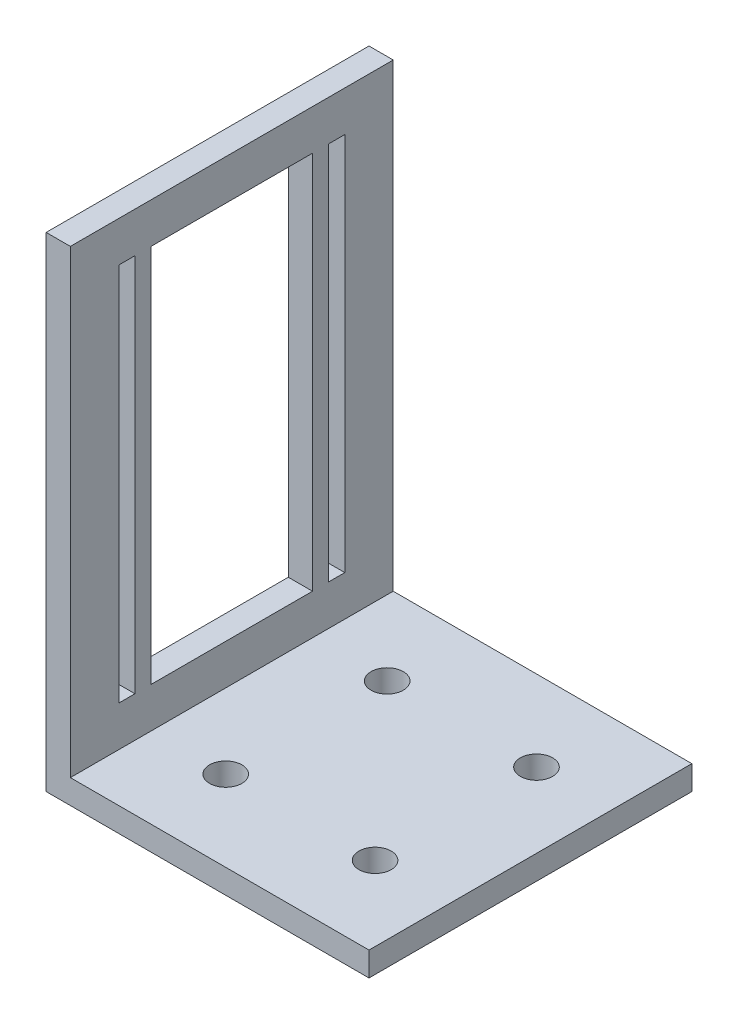
ISO-10303-21;
HEADER;
FILE_DESCRIPTION(('STEP AP214'),'2;1');
FILE_NAME('part.step','',(''),(''),'','','');
FILE_SCHEMA(('AUTOMOTIVE_DESIGN { 1 0 10303 214 1 1 1 1 }'));
ENDSEC;
DATA;
#1=APPLICATION_CONTEXT('core data for automotive mechanical design processes');
#2=APPLICATION_PROTOCOL_DEFINITION('international standard','automotive_design',2000,#1);
#3=PRODUCT_CONTEXT('',#1,'mechanical');
#4=PRODUCT('Part','Part','',(#3));
#5=PRODUCT_RELATED_PRODUCT_CATEGORY('part','',(#4));
#6=PRODUCT_DEFINITION_FORMATION('','',#4);
#7=PRODUCT_DEFINITION_CONTEXT('part definition',#1,'design');
#8=PRODUCT_DEFINITION('design','',#6,#7);
#9=PRODUCT_DEFINITION_SHAPE('','',#8);
#10=(LENGTH_UNIT() NAMED_UNIT(*) SI_UNIT(.MILLI.,.METRE.));
#11=(NAMED_UNIT(*) PLANE_ANGLE_UNIT() SI_UNIT($,.RADIAN.));
#12=(NAMED_UNIT(*) SI_UNIT($,.STERADIAN.) SOLID_ANGLE_UNIT());
#13=UNCERTAINTY_MEASURE_WITH_UNIT(LENGTH_MEASURE(1.E-05),#10,'distance_accuracy_value','');
#14=(GEOMETRIC_REPRESENTATION_CONTEXT(3) GLOBAL_UNCERTAINTY_ASSIGNED_CONTEXT((#13)) GLOBAL_UNIT_ASSIGNED_CONTEXT((#10,
#11,#12)) REPRESENTATION_CONTEXT('',''));
#15=CARTESIAN_POINT('',(0.,0.,0.));
#16=DIRECTION('',(0.,0.,1.));
#17=DIRECTION('',(1.,0.,0.));
#18=AXIS2_PLACEMENT_3D('',#15,#16,#17);
#19=CARTESIAN_POINT('',(0.,0.,40.));
#20=DIRECTION('',(-1.,0.,0.));
#21=DIRECTION('',(0.,-1.,0.));
#22=AXIS2_PLACEMENT_3D('',#19,#20,#21);
#23=PLANE('',#22);
#24=DIRECTION('',(0.,1.,0.));
#25=VECTOR('',#24,1.);
#26=CARTESIAN_POINT('',(0.,0.,0.));
#27=LINE('',#26,#25);
#28=CARTESIAN_POINT('',(0.,0.,0.));
#29=VERTEX_POINT('',#28);
#30=CARTESIAN_POINT('',(0.,3.,0.));
#31=VERTEX_POINT('',#30);
#32=EDGE_CURVE('E289',#29,#31,#27,.T.);
#33=ORIENTED_EDGE('',*,*,#32,.T.);
#34=DIRECTION('',(0.,0.,-1.));
#35=VECTOR('',#34,1.);
#36=CARTESIAN_POINT('',(0.,3.,40.));
#37=LINE('',#36,#35);
#38=CARTESIAN_POINT('',(0.,3.,40.));
#39=VERTEX_POINT('',#38);
#40=EDGE_CURVE('E11',#39,#31,#37,.T.);
#41=ORIENTED_EDGE('',*,*,#40,.F.);
#42=DIRECTION('',(0.,1.,0.));
#43=VECTOR('',#42,1.);
#44=CARTESIAN_POINT('',(0.,0.,40.));
#45=LINE('',#44,#43);
#46=CARTESIAN_POINT('',(0.,0.,40.));
#47=VERTEX_POINT('',#46);
#48=EDGE_CURVE('E274',#47,#39,#45,.T.);
#49=ORIENTED_EDGE('',*,*,#48,.F.);
#50=DIRECTION('',(0.,0.,-1.));
#51=VECTOR('',#50,1.);
#52=CARTESIAN_POINT('',(0.,0.,40.));
#53=LINE('',#52,#51);
#54=EDGE_CURVE('E288',#47,#29,#53,.T.);
#55=ORIENTED_EDGE('',*,*,#54,.T.);
#56=EDGE_LOOP('',(#33,#41,#49,#55));
#57=FACE_BOUND('',#56,.T.);
#58=ADVANCED_FACE('F33',(#57),#23,.F.);
#59=CARTESIAN_POINT('',(0.,3.,40.));
#60=DIRECTION('',(0.,-1.,0.));
#61=DIRECTION('',(1.,0.,0.));
#62=AXIS2_PLACEMENT_3D('',#59,#60,#61);
#63=PLANE('',#62);
#64=CARTESIAN_POINT('',(-9.25,3.,10.));
#65=DIRECTION('',(0.,1.,0.));
#66=DIRECTION('',(0.,0.,-1.));
#67=AXIS2_PLACEMENT_3D('',#64,#65,#66);
#68=CIRCLE('',#67,2.);
#69=CARTESIAN_POINT('',(-9.25,3.,8.));
#70=VERTEX_POINT('',#69);
#71=EDGE_CURVE('E261',#70,#70,#68,.T.);
#72=ORIENTED_EDGE('',*,*,#71,.F.);
#73=EDGE_LOOP('',(#72));
#74=FACE_BOUND('',#73,.T.);
#75=CARTESIAN_POINT('',(-27.75,3.,10.));
#76=DIRECTION('',(0.,1.,0.));
#77=DIRECTION('',(0.,0.,1.));
#78=AXIS2_PLACEMENT_3D('',#75,#76,#77);
#79=CIRCLE('',#78,2.);
#80=CARTESIAN_POINT('',(-27.75,3.,12.));
#81=VERTEX_POINT('',#80);
#82=EDGE_CURVE('E266',#81,#81,#79,.T.);
#83=ORIENTED_EDGE('',*,*,#82,.F.);
#84=EDGE_LOOP('',(#83));
#85=FACE_BOUND('',#84,.T.);
#86=CARTESIAN_POINT('',(-27.75,3.,30.));
#87=DIRECTION('',(0.,1.,0.));
#88=DIRECTION('',(0.,0.,-1.));
#89=AXIS2_PLACEMENT_3D('',#86,#87,#88);
#90=CIRCLE('',#89,2.);
#91=CARTESIAN_POINT('',(-27.75,3.,28.));
#92=VERTEX_POINT('',#91);
#93=EDGE_CURVE('E262',#92,#92,#90,.T.);
#94=ORIENTED_EDGE('',*,*,#93,.F.);
#95=EDGE_LOOP('',(#94));
#96=FACE_BOUND('',#95,.T.);
#97=CARTESIAN_POINT('',(-9.25,3.,30.));
#98=DIRECTION('',(0.,1.,0.));
#99=DIRECTION('',(0.,0.,1.));
#100=AXIS2_PLACEMENT_3D('',#97,#98,#99);
#101=CIRCLE('',#100,2.);
#102=CARTESIAN_POINT('',(-9.25,3.,32.));
#103=VERTEX_POINT('',#102);
#104=EDGE_CURVE('E265',#103,#103,#101,.T.);
#105=ORIENTED_EDGE('',*,*,#104,.F.);
#106=EDGE_LOOP('',(#105));
#107=FACE_BOUND('',#106,.T.);
#108=DIRECTION('',(-1.,0.,0.));
#109=VECTOR('',#108,1.);
#110=CARTESIAN_POINT('',(0.,3.,0.));
#111=LINE('',#110,#109);
#112=CARTESIAN_POINT('',(-37.,3.,0.));
#113=VERTEX_POINT('',#112);
#114=EDGE_CURVE('E292',#31,#113,#111,.T.);
#115=ORIENTED_EDGE('',*,*,#114,.T.);
#116=DIRECTION('',(0.,0.,-1.));
#117=VECTOR('',#116,1.);
#118=CARTESIAN_POINT('',(-37.,3.,40.));
#119=LINE('',#118,#117);
#120=CARTESIAN_POINT('',(-37.,3.,40.));
#121=VERTEX_POINT('',#120);
#122=EDGE_CURVE('E41',#121,#113,#119,.T.);
#123=ORIENTED_EDGE('',*,*,#122,.F.);
#124=DIRECTION('',(-1.,0.,0.));
#125=VECTOR('',#124,1.);
#126=CARTESIAN_POINT('',(0.,3.,40.));
#127=LINE('',#126,#125);
#128=EDGE_CURVE('E277',#39,#121,#127,.T.);
#129=ORIENTED_EDGE('',*,*,#128,.F.);
#130=ORIENTED_EDGE('',*,*,#40,.T.);
#131=EDGE_LOOP('',(#115,#123,#129,#130));
#132=FACE_BOUND('',#131,.T.);
#133=ADVANCED_FACE('F345',(#74,#85,#96,#107,#132),#63,.F.);
#134=CARTESIAN_POINT('',(-37.,3.,40.));
#135=DIRECTION('',(-1.,0.,0.));
#136=DIRECTION('',(0.,0.,1.));
#137=AXIS2_PLACEMENT_3D('',#134,#135,#136);
#138=PLANE('',#137);
#139=DIRECTION('',(0.,1.,0.));
#140=VECTOR('',#139,1.);
#141=CARTESIAN_POINT('',(-37.,2.99999999999999,34.));
#142=LINE('',#141,#140);
#143=CARTESIAN_POINT('',(-37.,8.,34.));
#144=VERTEX_POINT('',#143);
#145=CARTESIAN_POINT('',(-37.,55.,34.));
#146=VERTEX_POINT('',#145);
#147=EDGE_CURVE('E255',#144,#146,#142,.T.);
#148=ORIENTED_EDGE('',*,*,#147,.T.);
#149=DIRECTION('',(0.,0.,-1.));
#150=VECTOR('',#149,1.);
#151=CARTESIAN_POINT('',(-37.,55.,40.));
#152=LINE('',#151,#150);
#153=CARTESIAN_POINT('',(-37.,55.,32.));
#154=VERTEX_POINT('',#153);
#155=EDGE_CURVE('E258',#146,#154,#152,.T.);
#156=ORIENTED_EDGE('',*,*,#155,.T.);
#157=DIRECTION('',(0.,-1.,0.));
#158=VECTOR('',#157,1.);
#159=CARTESIAN_POINT('',(-37.,2.99999999999999,32.));
#160=LINE('',#159,#158);
#161=CARTESIAN_POINT('',(-37.,8.,32.));
#162=VERTEX_POINT('',#161);
#163=EDGE_CURVE('E252',#154,#162,#160,.T.);
#164=ORIENTED_EDGE('',*,*,#163,.T.);
#165=DIRECTION('',(0.,0.,1.));
#166=VECTOR('',#165,1.);
#167=CARTESIAN_POINT('',(-37.,8.00000000000001,40.));
#168=LINE('',#167,#166);
#169=EDGE_CURVE('E164',#162,#144,#168,.T.);
#170=ORIENTED_EDGE('',*,*,#169,.T.);
#171=EDGE_LOOP('',(#148,#156,#164,#170));
#172=FACE_BOUND('',#171,.T.);
#173=DIRECTION('',(0.,0.,1.));
#174=VECTOR('',#173,1.);
#175=CARTESIAN_POINT('',(-37.,7.99999999999999,40.));
#176=LINE('',#175,#174);
#177=CARTESIAN_POINT('',(-37.,7.99999999999999,6.00000000000001));
#178=VERTEX_POINT('',#177);
#179=CARTESIAN_POINT('',(-37.,7.99999999999999,8.00000000000001));
#180=VERTEX_POINT('',#179);
#181=EDGE_CURVE('E246',#178,#180,#176,.T.);
#182=ORIENTED_EDGE('',*,*,#181,.T.);
#183=DIRECTION('',(0.,1.,0.));
#184=VECTOR('',#183,1.);
#185=CARTESIAN_POINT('',(-37.,2.99999999999999,8.00000000000001));
#186=LINE('',#185,#184);
#187=CARTESIAN_POINT('',(-37.,55.,8.));
#188=VERTEX_POINT('',#187);
#189=EDGE_CURVE('E249',#180,#188,#186,.T.);
#190=ORIENTED_EDGE('',*,*,#189,.T.);
#191=DIRECTION('',(0.,0.,-1.));
#192=VECTOR('',#191,1.);
#193=CARTESIAN_POINT('',(-37.,55.,40.));
#194=LINE('',#193,#192);
#195=CARTESIAN_POINT('',(-37.,55.,6.));
#196=VERTEX_POINT('',#195);
#197=EDGE_CURVE('E240',#188,#196,#194,.T.);
#198=ORIENTED_EDGE('',*,*,#197,.T.);
#199=DIRECTION('',(0.,-1.,0.));
#200=VECTOR('',#199,1.);
#201=CARTESIAN_POINT('',(-37.,2.99999999999999,6.00000000000001));
#202=LINE('',#201,#200);
#203=EDGE_CURVE('E243',#196,#178,#202,.T.);
#204=ORIENTED_EDGE('',*,*,#203,.T.);
#205=EDGE_LOOP('',(#182,#190,#198,#204));
#206=FACE_BOUND('',#205,.T.);
#207=DIRECTION('',(0.,1.,0.));
#208=VECTOR('',#207,1.);
#209=CARTESIAN_POINT('',(-37.,2.99999999999999,30.));
#210=LINE('',#209,#208);
#211=CARTESIAN_POINT('',(-37.,7.99999999999999,30.));
#212=VERTEX_POINT('',#211);
#213=CARTESIAN_POINT('',(-37.,55.,30.));
#214=VERTEX_POINT('',#213);
#215=EDGE_CURVE('E234',#212,#214,#210,.T.);
#216=ORIENTED_EDGE('',*,*,#215,.T.);
#217=DIRECTION('',(0.,0.,-1.));
#218=VECTOR('',#217,1.);
#219=CARTESIAN_POINT('',(-37.,55.,40.));
#220=LINE('',#219,#218);
#221=CARTESIAN_POINT('',(-37.,55.,10.));
#222=VERTEX_POINT('',#221);
#223=EDGE_CURVE('E237',#214,#222,#220,.T.);
#224=ORIENTED_EDGE('',*,*,#223,.T.);
#225=DIRECTION('',(0.,-1.,0.));
#226=VECTOR('',#225,1.);
#227=CARTESIAN_POINT('',(-37.,2.99999999999999,10.));
#228=LINE('',#227,#226);
#229=CARTESIAN_POINT('',(-37.,7.99999999999999,10.));
#230=VERTEX_POINT('',#229);
#231=EDGE_CURVE('E188',#222,#230,#228,.T.);
#232=ORIENTED_EDGE('',*,*,#231,.T.);
#233=DIRECTION('',(0.,0.,1.));
#234=VECTOR('',#233,1.);
#235=CARTESIAN_POINT('',(-37.,7.99999999999999,40.));
#236=LINE('',#235,#234);
#237=EDGE_CURVE('E231',#230,#212,#236,.T.);
#238=ORIENTED_EDGE('',*,*,#237,.T.);
#239=EDGE_LOOP('',(#216,#224,#232,#238));
#240=FACE_BOUND('',#239,.T.);
#241=DIRECTION('',(0.,1.,0.));
#242=VECTOR('',#241,1.);
#243=CARTESIAN_POINT('',(-37.,3.,0.));
#244=LINE('',#243,#242);
#245=CARTESIAN_POINT('',(-37.,60.,0.));
#246=VERTEX_POINT('',#245);
#247=EDGE_CURVE('E294',#113,#246,#244,.T.);
#248=ORIENTED_EDGE('',*,*,#247,.T.);
#249=DIRECTION('',(0.,0.,-1.));
#250=VECTOR('',#249,1.);
#251=CARTESIAN_POINT('',(-37.,60.,40.));
#252=LINE('',#251,#250);
#253=CARTESIAN_POINT('',(-37.,60.,40.));
#254=VERTEX_POINT('',#253);
#255=EDGE_CURVE('E309',#254,#246,#252,.T.);
#256=ORIENTED_EDGE('',*,*,#255,.F.);
#257=DIRECTION('',(0.,1.,0.));
#258=VECTOR('',#257,1.);
#259=CARTESIAN_POINT('',(-37.,3.,40.));
#260=LINE('',#259,#258);
#261=EDGE_CURVE('E280',#121,#254,#260,.T.);
#262=ORIENTED_EDGE('',*,*,#261,.F.);
#263=ORIENTED_EDGE('',*,*,#122,.T.);
#264=EDGE_LOOP('',(#248,#256,#262,#263));
#265=FACE_BOUND('',#264,.T.);
#266=ADVANCED_FACE('F350',(#172,#206,#240,#265),#138,.F.);
#267=CARTESIAN_POINT('',(-37.,60.,40.));
#268=DIRECTION('',(0.,-1.,0.));
#269=DIRECTION('',(0.,0.,-1.));
#270=AXIS2_PLACEMENT_3D('',#267,#268,#269);
#271=PLANE('',#270);
#272=DIRECTION('',(-1.,0.,0.));
#273=VECTOR('',#272,1.);
#274=CARTESIAN_POINT('',(-37.,60.,0.));
#275=LINE('',#274,#273);
#276=CARTESIAN_POINT('',(-40.,60.,0.));
#277=VERTEX_POINT('',#276);
#278=EDGE_CURVE('E296',#246,#277,#275,.T.);
#279=ORIENTED_EDGE('',*,*,#278,.T.);
#280=DIRECTION('',(0.,0.,-1.));
#281=VECTOR('',#280,1.);
#282=CARTESIAN_POINT('',(-40.,60.,40.));
#283=LINE('',#282,#281);
#284=CARTESIAN_POINT('',(-40.,60.,40.));
#285=VERTEX_POINT('',#284);
#286=EDGE_CURVE('E306',#285,#277,#283,.T.);
#287=ORIENTED_EDGE('',*,*,#286,.F.);
#288=DIRECTION('',(-1.,0.,0.));
#289=VECTOR('',#288,1.);
#290=CARTESIAN_POINT('',(-37.,60.,40.));
#291=LINE('',#290,#289);
#292=EDGE_CURVE('E282',#254,#285,#291,.T.);
#293=ORIENTED_EDGE('',*,*,#292,.F.);
#294=ORIENTED_EDGE('',*,*,#255,.T.);
#295=EDGE_LOOP('',(#279,#287,#293,#294));
#296=FACE_BOUND('',#295,.T.);
#297=ADVANCED_FACE('F374',(#296),#271,.F.);
#298=CARTESIAN_POINT('',(-40.,0.,40.));
#299=DIRECTION('',(1.,0.,0.));
#300=DIRECTION('',(0.,0.,-1.));
#301=AXIS2_PLACEMENT_3D('',#298,#299,#300);
#302=PLANE('',#301);
#303=DIRECTION('',(0.,-1.,0.));
#304=VECTOR('',#303,1.);
#305=CARTESIAN_POINT('',(-40.,55.,32.));
#306=LINE('',#305,#304);
#307=CARTESIAN_POINT('',(-40.,55.,32.));
#308=VERTEX_POINT('',#307);
#309=CARTESIAN_POINT('',(-40.,8.,32.));
#310=VERTEX_POINT('',#309);
#311=EDGE_CURVE('E171',#308,#310,#306,.T.);
#312=ORIENTED_EDGE('',*,*,#311,.F.);
#313=DIRECTION('',(0.,0.,-1.));
#314=VECTOR('',#313,1.);
#315=CARTESIAN_POINT('',(-40.,55.,34.));
#316=LINE('',#315,#314);
#317=CARTESIAN_POINT('',(-40.,55.,34.));
#318=VERTEX_POINT('',#317);
#319=EDGE_CURVE('E176',#318,#308,#316,.T.);
#320=ORIENTED_EDGE('',*,*,#319,.F.);
#321=DIRECTION('',(0.,1.,0.));
#322=VECTOR('',#321,1.);
#323=CARTESIAN_POINT('',(-40.,55.,34.));
#324=LINE('',#323,#322);
#325=CARTESIAN_POINT('',(-40.,8.,34.));
#326=VERTEX_POINT('',#325);
#327=EDGE_CURVE('E181',#326,#318,#324,.T.);
#328=ORIENTED_EDGE('',*,*,#327,.F.);
#329=DIRECTION('',(0.,0.,1.));
#330=VECTOR('',#329,1.);
#331=CARTESIAN_POINT('',(-40.,8.,34.));
#332=LINE('',#331,#330);
#333=EDGE_CURVE('E161',#310,#326,#332,.T.);
#334=ORIENTED_EDGE('',*,*,#333,.F.);
#335=EDGE_LOOP('',(#312,#320,#328,#334));
#336=FACE_BOUND('',#335,.T.);
#337=DIRECTION('',(0.,0.,-1.));
#338=VECTOR('',#337,1.);
#339=CARTESIAN_POINT('',(-40.,55.,6.));
#340=LINE('',#339,#338);
#341=CARTESIAN_POINT('',(-40.,55.,8.));
#342=VERTEX_POINT('',#341);
#343=CARTESIAN_POINT('',(-40.,55.,6.));
#344=VERTEX_POINT('',#343);
#345=EDGE_CURVE('E193',#342,#344,#340,.T.);
#346=ORIENTED_EDGE('',*,*,#345,.F.);
#347=DIRECTION('',(0.,1.,0.));
#348=VECTOR('',#347,1.);
#349=CARTESIAN_POINT('',(-40.,55.,8.));
#350=LINE('',#349,#348);
#351=CARTESIAN_POINT('',(-40.,7.99999999999999,8.00000000000001));
#352=VERTEX_POINT('',#351);
#353=EDGE_CURVE('E191',#352,#342,#350,.T.);
#354=ORIENTED_EDGE('',*,*,#353,.F.);
#355=DIRECTION('',(0.,0.,1.));
#356=VECTOR('',#355,1.);
#357=CARTESIAN_POINT('',(-40.,7.99999999999999,6.00000000000001));
#358=LINE('',#357,#356);
#359=CARTESIAN_POINT('',(-40.,7.99999999999999,6.00000000000001));
#360=VERTEX_POINT('',#359);
#361=EDGE_CURVE('E199',#360,#352,#358,.T.);
#362=ORIENTED_EDGE('',*,*,#361,.F.);
#363=DIRECTION('',(0.,-1.,0.));
#364=VECTOR('',#363,1.);
#365=CARTESIAN_POINT('',(-40.,55.,6.));
#366=LINE('',#365,#364);
#367=EDGE_CURVE('E196',#344,#360,#366,.T.);
#368=ORIENTED_EDGE('',*,*,#367,.F.);
#369=EDGE_LOOP('',(#346,#354,#362,#368));
#370=FACE_BOUND('',#369,.T.);
#371=DIRECTION('',(0.,-1.,0.));
#372=VECTOR('',#371,1.);
#373=CARTESIAN_POINT('',(-40.,55.,10.));
#374=LINE('',#373,#372);
#375=CARTESIAN_POINT('',(-40.,55.,10.));
#376=VERTEX_POINT('',#375);
#377=CARTESIAN_POINT('',(-40.,7.99999999999999,10.));
#378=VERTEX_POINT('',#377);
#379=EDGE_CURVE('E212',#376,#378,#374,.T.);
#380=ORIENTED_EDGE('',*,*,#379,.F.);
#381=DIRECTION('',(0.,0.,-1.));
#382=VECTOR('',#381,1.);
#383=CARTESIAN_POINT('',(-40.,55.,10.));
#384=LINE('',#383,#382);
#385=CARTESIAN_POINT('',(-40.,55.,30.));
#386=VERTEX_POINT('',#385);
#387=EDGE_CURVE('E210',#386,#376,#384,.T.);
#388=ORIENTED_EDGE('',*,*,#387,.F.);
#389=DIRECTION('',(0.,1.,0.));
#390=VECTOR('',#389,1.);
#391=CARTESIAN_POINT('',(-40.,55.,30.));
#392=LINE('',#391,#390);
#393=CARTESIAN_POINT('',(-40.,7.99999999999999,30.));
#394=VERTEX_POINT('',#393);
#395=EDGE_CURVE('E218',#394,#386,#392,.T.);
#396=ORIENTED_EDGE('',*,*,#395,.F.);
#397=DIRECTION('',(0.,0.,1.));
#398=VECTOR('',#397,1.);
#399=CARTESIAN_POINT('',(-40.,7.99999999999999,30.));
#400=LINE('',#399,#398);
#401=EDGE_CURVE('E215',#378,#394,#400,.T.);
#402=ORIENTED_EDGE('',*,*,#401,.F.);
#403=EDGE_LOOP('',(#380,#388,#396,#402));
#404=FACE_BOUND('',#403,.T.);
#405=DIRECTION('',(0.,-1.,0.));
#406=VECTOR('',#405,1.);
#407=CARTESIAN_POINT('',(-40.,0.,0.));
#408=LINE('',#407,#406);
#409=CARTESIAN_POINT('',(-40.,0.,0.));
#410=VERTEX_POINT('',#409);
#411=EDGE_CURVE('E298',#277,#410,#408,.T.);
#412=ORIENTED_EDGE('',*,*,#411,.T.);
#413=DIRECTION('',(0.,0.,-1.));
#414=VECTOR('',#413,1.);
#415=CARTESIAN_POINT('',(-40.,0.,40.));
#416=LINE('',#415,#414);
#417=CARTESIAN_POINT('',(-40.,0.,40.));
#418=VERTEX_POINT('',#417);
#419=EDGE_CURVE('E303',#418,#410,#416,.T.);
#420=ORIENTED_EDGE('',*,*,#419,.F.);
#421=DIRECTION('',(0.,-1.,0.));
#422=VECTOR('',#421,1.);
#423=CARTESIAN_POINT('',(-40.,0.,40.));
#424=LINE('',#423,#422);
#425=EDGE_CURVE('E284',#285,#418,#424,.T.);
#426=ORIENTED_EDGE('',*,*,#425,.F.);
#427=ORIENTED_EDGE('',*,*,#286,.T.);
#428=EDGE_LOOP('',(#412,#420,#426,#427));
#429=FACE_BOUND('',#428,.T.);
#430=ADVANCED_FACE('F178',(#336,#370,#404,#429),#302,.F.);
#431=CARTESIAN_POINT('',(0.,0.,40.));
#432=DIRECTION('',(0.,1.,0.));
#433=DIRECTION('',(0.,0.,1.));
#434=AXIS2_PLACEMENT_3D('',#431,#432,#433);
#435=PLANE('',#434);
#436=CARTESIAN_POINT('',(-9.25,0.,10.));
#437=DIRECTION('',(0.,1.,0.));
#438=DIRECTION('',(0.,0.,1.));
#439=AXIS2_PLACEMENT_3D('',#436,#437,#438);
#440=CIRCLE('',#439,2.);
#441=CARTESIAN_POINT('',(-9.25,0.,12.));
#442=VERTEX_POINT('',#441);
#443=EDGE_CURVE('E36',#442,#442,#440,.T.);
#444=ORIENTED_EDGE('',*,*,#443,.T.);
#445=EDGE_LOOP('',(#444));
#446=FACE_BOUND('',#445,.T.);
#447=CARTESIAN_POINT('',(-27.75,0.,10.));
#448=DIRECTION('',(0.,1.,0.));
#449=DIRECTION('',(0.,0.,1.));
#450=AXIS2_PLACEMENT_3D('',#447,#448,#449);
#451=CIRCLE('',#450,2.);
#452=CARTESIAN_POINT('',(-27.75,0.,12.));
#453=VERTEX_POINT('',#452);
#454=EDGE_CURVE('E318',#453,#453,#451,.T.);
#455=ORIENTED_EDGE('',*,*,#454,.T.);
#456=EDGE_LOOP('',(#455));
#457=FACE_BOUND('',#456,.T.);
#458=CARTESIAN_POINT('',(-27.75,0.,30.));
#459=DIRECTION('',(0.,1.,0.));
#460=DIRECTION('',(0.,0.,1.));
#461=AXIS2_PLACEMENT_3D('',#458,#459,#460);
#462=CIRCLE('',#461,2.);
#463=CARTESIAN_POINT('',(-27.75,0.,32.));
#464=VERTEX_POINT('',#463);
#465=EDGE_CURVE('E316',#464,#464,#462,.T.);
#466=ORIENTED_EDGE('',*,*,#465,.T.);
#467=EDGE_LOOP('',(#466));
#468=FACE_BOUND('',#467,.T.);
#469=CARTESIAN_POINT('',(-9.25,0.,30.));
#470=DIRECTION('',(0.,1.,0.));
#471=DIRECTION('',(0.,0.,1.));
#472=AXIS2_PLACEMENT_3D('',#469,#470,#471);
#473=CIRCLE('',#472,2.);
#474=CARTESIAN_POINT('',(-9.25,0.,32.));
#475=VERTEX_POINT('',#474);
#476=EDGE_CURVE('E273',#475,#475,#473,.T.);
#477=ORIENTED_EDGE('',*,*,#476,.T.);
#478=EDGE_LOOP('',(#477));
#479=FACE_BOUND('',#478,.T.);
#480=DIRECTION('',(1.,0.,0.));
#481=VECTOR('',#480,1.);
#482=CARTESIAN_POINT('',(0.,0.,0.));
#483=LINE('',#482,#481);
#484=EDGE_CURVE('E278',#410,#29,#483,.T.);
#485=ORIENTED_EDGE('',*,*,#484,.T.);
#486=ORIENTED_EDGE('',*,*,#54,.F.);
#487=DIRECTION('',(1.,0.,0.));
#488=VECTOR('',#487,1.);
#489=CARTESIAN_POINT('',(0.,0.,40.));
#490=LINE('',#489,#488);
#491=EDGE_CURVE('E286',#418,#47,#490,.T.);
#492=ORIENTED_EDGE('',*,*,#491,.F.);
#493=ORIENTED_EDGE('',*,*,#419,.T.);
#494=EDGE_LOOP('',(#485,#486,#492,#493));
#495=FACE_BOUND('',#494,.T.);
#496=ADVANCED_FACE('F325',(#446,#457,#468,#479,#495),#435,.F.);
#497=CARTESIAN_POINT('',(0.,0.,40.));
#498=DIRECTION('',(0.,0.,1.));
#499=DIRECTION('',(1.,0.,0.));
#500=AXIS2_PLACEMENT_3D('',#497,#498,#499);
#501=PLANE('',#500);
#502=ORIENTED_EDGE('',*,*,#48,.T.);
#503=ORIENTED_EDGE('',*,*,#128,.T.);
#504=ORIENTED_EDGE('',*,*,#261,.T.);
#505=ORIENTED_EDGE('',*,*,#292,.T.);
#506=ORIENTED_EDGE('',*,*,#425,.T.);
#507=ORIENTED_EDGE('',*,*,#491,.T.);
#508=EDGE_LOOP('',(#502,#503,#504,#505,#506,#507));
#509=FACE_BOUND('',#508,.T.);
#510=ADVANCED_FACE('F366',(#509),#501,.T.);
#511=CARTESIAN_POINT('',(0.,0.,0.));
#512=DIRECTION('',(0.,0.,1.));
#513=DIRECTION('',(1.,0.,0.));
#514=AXIS2_PLACEMENT_3D('',#511,#512,#513);
#515=PLANE('',#514);
#516=ORIENTED_EDGE('',*,*,#32,.F.);
#517=ORIENTED_EDGE('',*,*,#484,.F.);
#518=ORIENTED_EDGE('',*,*,#411,.F.);
#519=ORIENTED_EDGE('',*,*,#278,.F.);
#520=ORIENTED_EDGE('',*,*,#247,.F.);
#521=ORIENTED_EDGE('',*,*,#114,.F.);
#522=EDGE_LOOP('',(#516,#517,#518,#519,#520,#521));
#523=FACE_BOUND('',#522,.T.);
#524=ADVANCED_FACE('F358',(#523),#515,.F.);
#525=CARTESIAN_POINT('',(-9.25,-37.,30.));
#526=DIRECTION('',(0.,1.,0.));
#527=DIRECTION('',(0.,0.,1.));
#528=AXIS2_PLACEMENT_3D('',#525,#526,#527);
#529=CYLINDRICAL_SURFACE('',#528,2.);
#530=ORIENTED_EDGE('',*,*,#104,.T.);
#531=EDGE_LOOP('',(#530));
#532=FACE_BOUND('',#531,.T.);
#533=ORIENTED_EDGE('',*,*,#476,.F.);
#534=EDGE_LOOP('',(#533));
#535=FACE_BOUND('',#534,.T.);
#536=ADVANCED_FACE('F393',(#532,#535),#529,.F.);
#537=CARTESIAN_POINT('',(-27.75,-37.,30.));
#538=DIRECTION('',(0.,1.,0.));
#539=DIRECTION('',(0.,0.,1.));
#540=AXIS2_PLACEMENT_3D('',#537,#538,#539);
#541=CYLINDRICAL_SURFACE('',#540,2.);
#542=ORIENTED_EDGE('',*,*,#93,.T.);
#543=EDGE_LOOP('',(#542));
#544=FACE_BOUND('',#543,.T.);
#545=ORIENTED_EDGE('',*,*,#465,.F.);
#546=EDGE_LOOP('',(#545));
#547=FACE_BOUND('',#546,.T.);
#548=ADVANCED_FACE('F340',(#544,#547),#541,.F.);
#549=CARTESIAN_POINT('',(-27.75,-37.,10.));
#550=DIRECTION('',(0.,1.,0.));
#551=DIRECTION('',(0.,0.,1.));
#552=AXIS2_PLACEMENT_3D('',#549,#550,#551);
#553=CYLINDRICAL_SURFACE('',#552,2.);
#554=ORIENTED_EDGE('',*,*,#82,.T.);
#555=EDGE_LOOP('',(#554));
#556=FACE_BOUND('',#555,.T.);
#557=ORIENTED_EDGE('',*,*,#454,.F.);
#558=EDGE_LOOP('',(#557));
#559=FACE_BOUND('',#558,.T.);
#560=ADVANCED_FACE('F330',(#556,#559),#553,.F.);
#561=CARTESIAN_POINT('',(-9.25,-37.,10.));
#562=DIRECTION('',(0.,1.,0.));
#563=DIRECTION('',(0.,0.,1.));
#564=AXIS2_PLACEMENT_3D('',#561,#562,#563);
#565=CYLINDRICAL_SURFACE('',#564,2.);
#566=ORIENTED_EDGE('',*,*,#71,.T.);
#567=EDGE_LOOP('',(#566));
#568=FACE_BOUND('',#567,.T.);
#569=ORIENTED_EDGE('',*,*,#443,.F.);
#570=EDGE_LOOP('',(#569));
#571=FACE_BOUND('',#570,.T.);
#572=ADVANCED_FACE('F327',(#568,#571),#565,.F.);
#573=CARTESIAN_POINT('',(0.,55.,10.));
#574=DIRECTION('',(0.,1.,0.));
#575=DIRECTION('',(0.,0.,1.));
#576=AXIS2_PLACEMENT_3D('',#573,#574,#575);
#577=PLANE('',#576);
#578=DIRECTION('',(-1.,0.,0.));
#579=VECTOR('',#578,1.);
#580=CARTESIAN_POINT('',(0.,55.,30.));
#581=LINE('',#580,#579);
#582=EDGE_CURVE('E194',#214,#386,#581,.T.);
#583=ORIENTED_EDGE('',*,*,#582,.T.);
#584=ORIENTED_EDGE('',*,*,#387,.T.);
#585=DIRECTION('',(-1.,0.,0.));
#586=VECTOR('',#585,1.);
#587=CARTESIAN_POINT('',(0.,55.,10.));
#588=LINE('',#587,#586);
#589=EDGE_CURVE('E221',#222,#376,#588,.T.);
#590=ORIENTED_EDGE('',*,*,#589,.F.);
#591=ORIENTED_EDGE('',*,*,#223,.F.);
#592=EDGE_LOOP('',(#583,#584,#590,#591));
#593=FACE_BOUND('',#592,.T.);
#594=ADVANCED_FACE('F329',(#593),#577,.F.);
#595=CARTESIAN_POINT('',(0.,55.,30.));
#596=DIRECTION('',(0.,0.,1.));
#597=DIRECTION('',(0.,-1.,0.));
#598=AXIS2_PLACEMENT_3D('',#595,#596,#597);
#599=PLANE('',#598);
#600=DIRECTION('',(-1.,0.,0.));
#601=VECTOR('',#600,1.);
#602=CARTESIAN_POINT('',(0.,7.99999999999999,30.));
#603=LINE('',#602,#601);
#604=EDGE_CURVE('E223',#212,#394,#603,.T.);
#605=ORIENTED_EDGE('',*,*,#604,.T.);
#606=ORIENTED_EDGE('',*,*,#395,.T.);
#607=ORIENTED_EDGE('',*,*,#582,.F.);
#608=ORIENTED_EDGE('',*,*,#215,.F.);
#609=EDGE_LOOP('',(#605,#606,#607,#608));
#610=FACE_BOUND('',#609,.T.);
#611=ADVANCED_FACE('F337',(#610),#599,.F.);
#612=CARTESIAN_POINT('',(0.,7.99999999999999,30.));
#613=DIRECTION('',(0.,-1.,0.));
#614=DIRECTION('',(0.,0.,-1.));
#615=AXIS2_PLACEMENT_3D('',#612,#613,#614);
#616=PLANE('',#615);
#617=DIRECTION('',(-1.,0.,0.));
#618=VECTOR('',#617,1.);
#619=CARTESIAN_POINT('',(0.,7.99999999999999,10.));
#620=LINE('',#619,#618);
#621=EDGE_CURVE('E225',#230,#378,#620,.T.);
#622=ORIENTED_EDGE('',*,*,#621,.T.);
#623=ORIENTED_EDGE('',*,*,#401,.T.);
#624=ORIENTED_EDGE('',*,*,#604,.F.);
#625=ORIENTED_EDGE('',*,*,#237,.F.);
#626=EDGE_LOOP('',(#622,#623,#624,#625));
#627=FACE_BOUND('',#626,.T.);
#628=ADVANCED_FACE('F415',(#627),#616,.F.);
#629=CARTESIAN_POINT('',(0.,55.,10.));
#630=DIRECTION('',(0.,0.,-1.));
#631=DIRECTION('',(0.,1.,0.));
#632=AXIS2_PLACEMENT_3D('',#629,#630,#631);
#633=PLANE('',#632);
#634=ORIENTED_EDGE('',*,*,#589,.T.);
#635=ORIENTED_EDGE('',*,*,#379,.T.);
#636=ORIENTED_EDGE('',*,*,#621,.F.);
#637=ORIENTED_EDGE('',*,*,#231,.F.);
#638=EDGE_LOOP('',(#634,#635,#636,#637));
#639=FACE_BOUND('',#638,.T.);
#640=ADVANCED_FACE('F411',(#639),#633,.F.);
#641=CARTESIAN_POINT('',(0.,55.,8.));
#642=DIRECTION('',(0.,0.,1.));
#643=DIRECTION('',(0.,-1.,0.));
#644=AXIS2_PLACEMENT_3D('',#641,#642,#643);
#645=PLANE('',#644);
#646=DIRECTION('',(-1.,0.,0.));
#647=VECTOR('',#646,1.);
#648=CARTESIAN_POINT('',(0.,7.99999999999999,8.00000000000001));
#649=LINE('',#648,#647);
#650=EDGE_CURVE('E203',#180,#352,#649,.T.);
#651=ORIENTED_EDGE('',*,*,#650,.T.);
#652=ORIENTED_EDGE('',*,*,#353,.T.);
#653=DIRECTION('',(-1.,0.,0.));
#654=VECTOR('',#653,1.);
#655=CARTESIAN_POINT('',(0.,55.,8.));
#656=LINE('',#655,#654);
#657=EDGE_CURVE('E202',#188,#342,#656,.T.);
#658=ORIENTED_EDGE('',*,*,#657,.F.);
#659=ORIENTED_EDGE('',*,*,#189,.F.);
#660=EDGE_LOOP('',(#651,#652,#658,#659));
#661=FACE_BOUND('',#660,.T.);
#662=ADVANCED_FACE('F414',(#661),#645,.F.);
#663=CARTESIAN_POINT('',(0.,7.99999999999999,6.00000000000001));
#664=DIRECTION('',(0.,-1.,0.));
#665=DIRECTION('',(0.,0.,-1.));
#666=AXIS2_PLACEMENT_3D('',#663,#664,#665);
#667=PLANE('',#666);
#668=DIRECTION('',(-1.,0.,0.));
#669=VECTOR('',#668,1.);
#670=CARTESIAN_POINT('',(0.,7.99999999999999,6.00000000000001));
#671=LINE('',#670,#669);
#672=EDGE_CURVE('E205',#178,#360,#671,.T.);
#673=ORIENTED_EDGE('',*,*,#672,.T.);
#674=ORIENTED_EDGE('',*,*,#361,.T.);
#675=ORIENTED_EDGE('',*,*,#650,.F.);
#676=ORIENTED_EDGE('',*,*,#181,.F.);
#677=EDGE_LOOP('',(#673,#674,#675,#676));
#678=FACE_BOUND('',#677,.T.);
#679=ADVANCED_FACE('F425',(#678),#667,.F.);
#680=CARTESIAN_POINT('',(0.,55.,6.));
#681=DIRECTION('',(0.,0.,-1.));
#682=DIRECTION('',(0.,1.,0.));
#683=AXIS2_PLACEMENT_3D('',#680,#681,#682);
#684=PLANE('',#683);
#685=DIRECTION('',(-1.,0.,0.));
#686=VECTOR('',#685,1.);
#687=CARTESIAN_POINT('',(0.,55.,6.));
#688=LINE('',#687,#686);
#689=EDGE_CURVE('E57',#196,#344,#688,.T.);
#690=ORIENTED_EDGE('',*,*,#689,.T.);
#691=ORIENTED_EDGE('',*,*,#367,.T.);
#692=ORIENTED_EDGE('',*,*,#672,.F.);
#693=ORIENTED_EDGE('',*,*,#203,.F.);
#694=EDGE_LOOP('',(#690,#691,#692,#693));
#695=FACE_BOUND('',#694,.T.);
#696=ADVANCED_FACE('F431',(#695),#684,.F.);
#697=CARTESIAN_POINT('',(0.,55.,6.));
#698=DIRECTION('',(0.,1.,0.));
#699=DIRECTION('',(0.,0.,1.));
#700=AXIS2_PLACEMENT_3D('',#697,#698,#699);
#701=PLANE('',#700);
#702=ORIENTED_EDGE('',*,*,#657,.T.);
#703=ORIENTED_EDGE('',*,*,#345,.T.);
#704=ORIENTED_EDGE('',*,*,#689,.F.);
#705=ORIENTED_EDGE('',*,*,#197,.F.);
#706=EDGE_LOOP('',(#702,#703,#704,#705));
#707=FACE_BOUND('',#706,.T.);
#708=ADVANCED_FACE('F427',(#707),#701,.F.);
#709=CARTESIAN_POINT('',(0.,55.,34.));
#710=DIRECTION('',(0.,1.,0.));
#711=DIRECTION('',(0.,0.,1.));
#712=AXIS2_PLACEMENT_3D('',#709,#710,#711);
#713=PLANE('',#712);
#714=DIRECTION('',(-1.,0.,0.));
#715=VECTOR('',#714,1.);
#716=CARTESIAN_POINT('',(0.,55.,34.));
#717=LINE('',#716,#715);
#718=EDGE_CURVE('E186',#146,#318,#717,.T.);
#719=ORIENTED_EDGE('',*,*,#718,.T.);
#720=ORIENTED_EDGE('',*,*,#319,.T.);
#721=DIRECTION('',(-1.,0.,0.));
#722=VECTOR('',#721,1.);
#723=CARTESIAN_POINT('',(0.,55.,32.));
#724=LINE('',#723,#722);
#725=EDGE_CURVE('E167',#154,#308,#724,.T.);
#726=ORIENTED_EDGE('',*,*,#725,.F.);
#727=ORIENTED_EDGE('',*,*,#155,.F.);
#728=EDGE_LOOP('',(#719,#720,#726,#727));
#729=FACE_BOUND('',#728,.T.);
#730=ADVANCED_FACE('F430',(#729),#713,.F.);
#731=CARTESIAN_POINT('',(0.,55.,34.));
#732=DIRECTION('',(0.,0.,1.));
#733=DIRECTION('',(0.,-1.,0.));
#734=AXIS2_PLACEMENT_3D('',#731,#732,#733);
#735=PLANE('',#734);
#736=DIRECTION('',(-1.,0.,0.));
#737=VECTOR('',#736,1.);
#738=CARTESIAN_POINT('',(0.,8.,34.));
#739=LINE('',#738,#737);
#740=EDGE_CURVE('E166',#144,#326,#739,.T.);
#741=ORIENTED_EDGE('',*,*,#740,.T.);
#742=ORIENTED_EDGE('',*,*,#327,.T.);
#743=ORIENTED_EDGE('',*,*,#718,.F.);
#744=ORIENTED_EDGE('',*,*,#147,.F.);
#745=EDGE_LOOP('',(#741,#742,#743,#744));
#746=FACE_BOUND('',#745,.T.);
#747=ADVANCED_FACE('F440',(#746),#735,.F.);
#748=CARTESIAN_POINT('',(0.,8.,34.));
#749=DIRECTION('',(0.,-1.,0.));
#750=DIRECTION('',(0.,0.,-1.));
#751=AXIS2_PLACEMENT_3D('',#748,#749,#750);
#752=PLANE('',#751);
#753=DIRECTION('',(-1.,0.,0.));
#754=VECTOR('',#753,1.);
#755=CARTESIAN_POINT('',(0.,8.,32.));
#756=LINE('',#755,#754);
#757=EDGE_CURVE('E49',#162,#310,#756,.T.);
#758=ORIENTED_EDGE('',*,*,#757,.T.);
#759=ORIENTED_EDGE('',*,*,#333,.T.);
#760=ORIENTED_EDGE('',*,*,#740,.F.);
#761=ORIENTED_EDGE('',*,*,#169,.F.);
#762=EDGE_LOOP('',(#758,#759,#760,#761));
#763=FACE_BOUND('',#762,.T.);
#764=ADVANCED_FACE('F158',(#763),#752,.F.);
#765=CARTESIAN_POINT('',(0.,55.,32.));
#766=DIRECTION('',(0.,0.,-1.));
#767=DIRECTION('',(0.,1.,0.));
#768=AXIS2_PLACEMENT_3D('',#765,#766,#767);
#769=PLANE('',#768);
#770=ORIENTED_EDGE('',*,*,#725,.T.);
#771=ORIENTED_EDGE('',*,*,#311,.T.);
#772=ORIENTED_EDGE('',*,*,#757,.F.);
#773=ORIENTED_EDGE('',*,*,#163,.F.);
#774=EDGE_LOOP('',(#770,#771,#772,#773));
#775=FACE_BOUND('',#774,.T.);
#776=ADVANCED_FACE('F172',(#775),#769,.F.);
#777=CLOSED_SHELL('',(#58,#133,#266,#297,#430,#496,#510,#524,#536,#548,#560,#572,#594,#611,#628,
#640,#662,#679,#696,#708,#730,#747,#764,#776));
#778=MANIFOLD_SOLID_BREP('B2',#777);
#779=ADVANCED_BREP_SHAPE_REPRESENTATION('',(#18,#778),#14);
#780=SHAPE_DEFINITION_REPRESENTATION(#9,#779);
ENDSEC;
END-ISO-10303-21;
